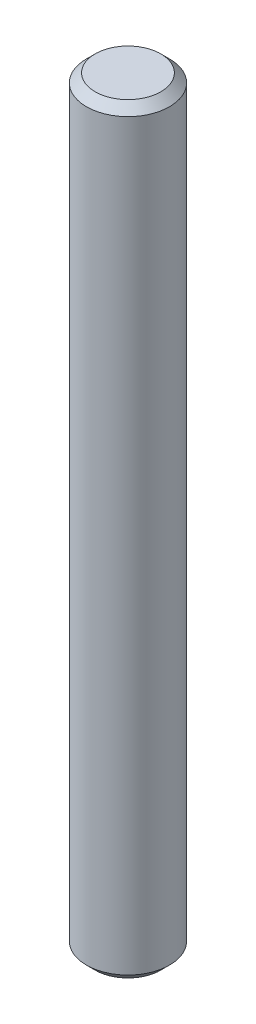
ISO-10303-21;
HEADER;
FILE_DESCRIPTION(('STEP AP214'),'2;1');
FILE_NAME('part.step','',(''),(''),'','','');
FILE_SCHEMA(('AUTOMOTIVE_DESIGN { 1 0 10303 214 1 1 1 1 }'));
ENDSEC;
DATA;
#1=APPLICATION_CONTEXT('core data for automotive mechanical design processes');
#2=APPLICATION_PROTOCOL_DEFINITION('international standard','automotive_design',2000,#1);
#3=PRODUCT_CONTEXT('',#1,'mechanical');
#4=PRODUCT('Part','Part','',(#3));
#5=PRODUCT_RELATED_PRODUCT_CATEGORY('part','',(#4));
#6=PRODUCT_DEFINITION_FORMATION('','',#4);
#7=PRODUCT_DEFINITION_CONTEXT('part definition',#1,'design');
#8=PRODUCT_DEFINITION('design','',#6,#7);
#9=PRODUCT_DEFINITION_SHAPE('','',#8);
#10=(LENGTH_UNIT() NAMED_UNIT(*) SI_UNIT(.MILLI.,.METRE.));
#11=(NAMED_UNIT(*) PLANE_ANGLE_UNIT() SI_UNIT($,.RADIAN.));
#12=(NAMED_UNIT(*) SI_UNIT($,.STERADIAN.) SOLID_ANGLE_UNIT());
#13=UNCERTAINTY_MEASURE_WITH_UNIT(LENGTH_MEASURE(1.E-05),#10,'distance_accuracy_value','');
#14=(GEOMETRIC_REPRESENTATION_CONTEXT(3) GLOBAL_UNCERTAINTY_ASSIGNED_CONTEXT((#13)) GLOBAL_UNIT_ASSIGNED_CONTEXT((#10,
#11,#12)) REPRESENTATION_CONTEXT('',''));
#15=CARTESIAN_POINT('',(0.,0.,0.));
#16=DIRECTION('',(0.,0.,1.));
#17=DIRECTION('',(1.,0.,0.));
#18=AXIS2_PLACEMENT_3D('',#15,#16,#17);
#19=CARTESIAN_POINT('',(0.,11.,0.));
#20=DIRECTION('',(0.,-1.,0.));
#21=DIRECTION('',(0.,0.,-1.));
#22=AXIS2_PLACEMENT_3D('',#19,#20,#21);
#23=CYLINDRICAL_SURFACE('',#22,1.2);
#24=CARTESIAN_POINT('',(0.,-10.75,0.));
#25=DIRECTION('',(0.,1.,0.));
#26=DIRECTION('',(0.,0.,1.));
#27=AXIS2_PLACEMENT_3D('',#24,#25,#26);
#28=CIRCLE('',#27,1.2);
#29=CARTESIAN_POINT('',(0.,-10.75,1.2));
#30=VERTEX_POINT('',#29);
#31=EDGE_CURVE('E53',#30,#30,#28,.T.);
#32=ORIENTED_EDGE('',*,*,#31,.T.);
#33=EDGE_LOOP('',(#32));
#34=FACE_BOUND('',#33,.T.);
#35=CARTESIAN_POINT('',(0.,10.75,0.));
#36=DIRECTION('',(0.,1.,0.));
#37=DIRECTION('',(0.,0.,1.));
#38=AXIS2_PLACEMENT_3D('',#35,#36,#37);
#39=CIRCLE('',#38,1.2);
#40=CARTESIAN_POINT('',(0.,10.75,1.2));
#41=VERTEX_POINT('',#40);
#42=EDGE_CURVE('E57',#41,#41,#39,.F.);
#43=ORIENTED_EDGE('',*,*,#42,.T.);
#44=EDGE_LOOP('',(#43));
#45=FACE_BOUND('',#44,.T.);
#46=ADVANCED_FACE('F41',(#34,#45),#23,.T.);
#47=CARTESIAN_POINT('',(0.,11.,0.));
#48=DIRECTION('',(0.,1.,0.));
#49=DIRECTION('',(0.,0.,1.));
#50=AXIS2_PLACEMENT_3D('',#47,#48,#49);
#51=PLANE('',#50);
#52=CARTESIAN_POINT('',(0.,11.,0.));
#53=DIRECTION('',(0.,1.,0.));
#54=DIRECTION('',(0.,0.,1.));
#55=AXIS2_PLACEMENT_3D('',#52,#53,#54);
#56=CIRCLE('',#55,0.95);
#57=CARTESIAN_POINT('',(0.,11.,0.95));
#58=VERTEX_POINT('',#57);
#59=EDGE_CURVE('E10',#58,#58,#56,.T.);
#60=ORIENTED_EDGE('',*,*,#59,.T.);
#61=EDGE_LOOP('',(#60));
#62=FACE_BOUND('',#61,.T.);
#63=ADVANCED_FACE('F73',(#62),#51,.T.);
#64=CARTESIAN_POINT('',(0.,-11.,0.));
#65=DIRECTION('',(0.,1.,0.));
#66=DIRECTION('',(0.,0.,1.));
#67=AXIS2_PLACEMENT_3D('',#64,#65,#66);
#68=PLANE('',#67);
#69=CARTESIAN_POINT('',(0.,-11.,0.));
#70=DIRECTION('',(0.,1.,0.));
#71=DIRECTION('',(0.,0.,1.));
#72=AXIS2_PLACEMENT_3D('',#69,#70,#71);
#73=CIRCLE('',#72,0.949999999999993);
#74=CARTESIAN_POINT('',(0.,-11.,0.949999999999993));
#75=VERTEX_POINT('',#74);
#76=EDGE_CURVE('E49',#75,#75,#73,.F.);
#77=ORIENTED_EDGE('',*,*,#76,.T.);
#78=EDGE_LOOP('',(#77));
#79=FACE_BOUND('',#78,.T.);
#80=ADVANCED_FACE('F70',(#79),#68,.F.);
#81=CARTESIAN_POINT('',(0.,-10.75,0.));
#82=DIRECTION('',(0.,1.,0.));
#83=DIRECTION('',(0.,0.,1.));
#84=AXIS2_PLACEMENT_3D('',#81,#82,#83);
#85=CONICAL_SURFACE('',#84,1.2,0.785398163397456);
#86=ORIENTED_EDGE('',*,*,#76,.F.);
#87=EDGE_LOOP('',(#86));
#88=FACE_BOUND('',#87,.T.);
#89=ORIENTED_EDGE('',*,*,#31,.F.);
#90=EDGE_LOOP('',(#89));
#91=FACE_BOUND('',#90,.T.);
#92=ADVANCED_FACE('F66',(#88,#91),#85,.T.);
#93=CARTESIAN_POINT('',(0.,11.,0.));
#94=DIRECTION('',(0.,-1.,0.));
#95=DIRECTION('',(0.,0.,-1.));
#96=AXIS2_PLACEMENT_3D('',#93,#94,#95);
#97=CONICAL_SURFACE('',#96,0.95,0.785398163397442);
#98=ORIENTED_EDGE('',*,*,#42,.F.);
#99=EDGE_LOOP('',(#98));
#100=FACE_BOUND('',#99,.T.);
#101=ORIENTED_EDGE('',*,*,#59,.F.);
#102=EDGE_LOOP('',(#101));
#103=FACE_BOUND('',#102,.T.);
#104=ADVANCED_FACE('F44',(#100,#103),#97,.T.);
#105=CLOSED_SHELL('',(#46,#63,#80,#92,#104));
#106=MANIFOLD_SOLID_BREP('B2',#105);
#107=ADVANCED_BREP_SHAPE_REPRESENTATION('',(#18,#106),#14);
#108=SHAPE_DEFINITION_REPRESENTATION(#9,#107);
ENDSEC;
END-ISO-10303-21;
